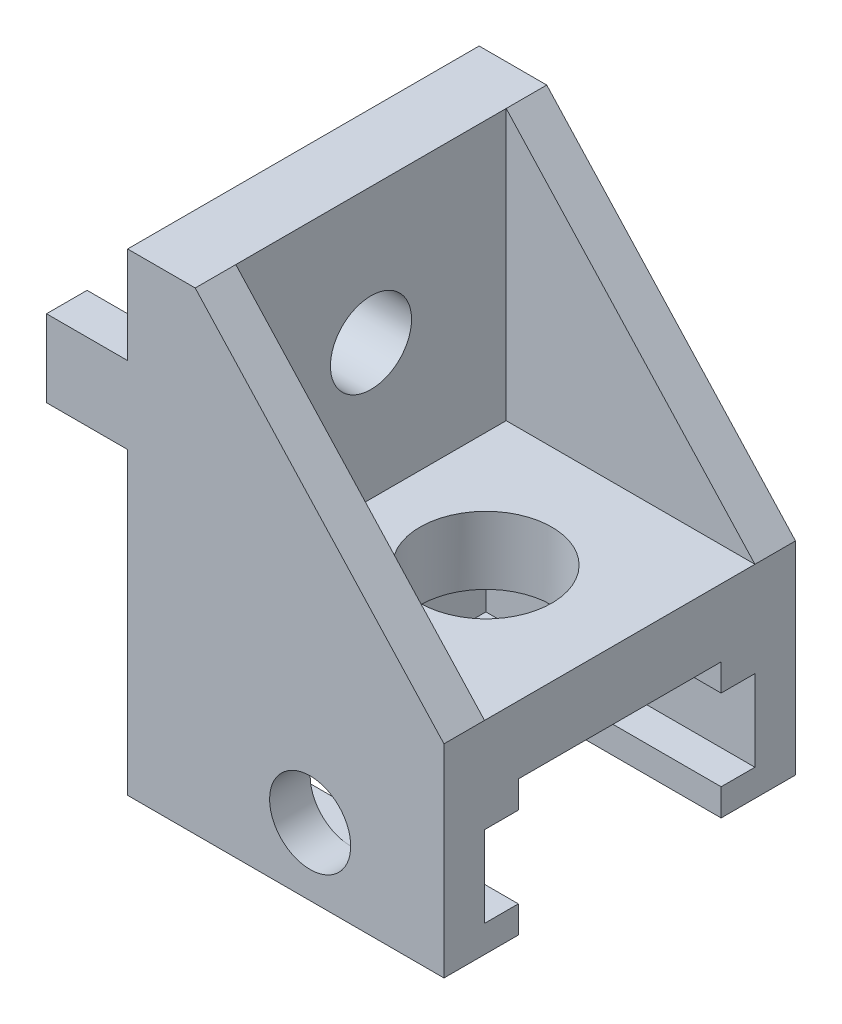
ISO-10303-21;
HEADER;
FILE_DESCRIPTION(('STEP AP214'),'2;1');
FILE_NAME('part.step','',(''),(''),'','','');
FILE_SCHEMA(('AUTOMOTIVE_DESIGN { 1 0 10303 214 1 1 1 1 }'));
ENDSEC;
DATA;
#1=APPLICATION_CONTEXT('core data for automotive mechanical design processes');
#2=APPLICATION_PROTOCOL_DEFINITION('international standard','automotive_design',2000,#1);
#3=PRODUCT_CONTEXT('',#1,'mechanical');
#4=PRODUCT('Part','Part','',(#3));
#5=PRODUCT_RELATED_PRODUCT_CATEGORY('part','',(#4));
#6=PRODUCT_DEFINITION_FORMATION('','',#4);
#7=PRODUCT_DEFINITION_CONTEXT('part definition',#1,'design');
#8=PRODUCT_DEFINITION('design','',#6,#7);
#9=PRODUCT_DEFINITION_SHAPE('','',#8);
#10=(LENGTH_UNIT() NAMED_UNIT(*) SI_UNIT(.MILLI.,.METRE.));
#11=(NAMED_UNIT(*) PLANE_ANGLE_UNIT() SI_UNIT($,.RADIAN.));
#12=(NAMED_UNIT(*) SI_UNIT($,.STERADIAN.) SOLID_ANGLE_UNIT());
#13=UNCERTAINTY_MEASURE_WITH_UNIT(LENGTH_MEASURE(1.E-05),#10,'distance_accuracy_value','');
#14=(GEOMETRIC_REPRESENTATION_CONTEXT(3) GLOBAL_UNCERTAINTY_ASSIGNED_CONTEXT((#13)) GLOBAL_UNIT_ASSIGNED_CONTEXT((#10,
#11,#12)) REPRESENTATION_CONTEXT('',''));
#15=CARTESIAN_POINT('',(0.,0.,0.));
#16=DIRECTION('',(0.,0.,1.));
#17=DIRECTION('',(1.,0.,0.));
#18=AXIS2_PLACEMENT_3D('',#15,#16,#17);
#19=CARTESIAN_POINT('',(0.,15.,0.));
#20=DIRECTION('',(0.,1.,0.));
#21=DIRECTION('',(0.,0.,1.));
#22=AXIS2_PLACEMENT_3D('',#19,#20,#21);
#23=PLANE('',#22);
#24=CARTESIAN_POINT('',(0.,15.,0.));
#25=DIRECTION('',(0.,1.,0.));
#26=DIRECTION('',(0.,0.,1.));
#27=AXIS2_PLACEMENT_3D('',#24,#25,#26);
#28=CIRCLE('',#27,4.875);
#29=CARTESIAN_POINT('',(0.,15.,4.875));
#30=VERTEX_POINT('',#29);
#31=EDGE_CURVE('E487',#30,#30,#28,.T.);
#32=ORIENTED_EDGE('',*,*,#31,.F.);
#33=EDGE_LOOP('',(#32));
#34=FACE_BOUND('',#33,.T.);
#35=DIRECTION('',(0.,0.,-1.));
#36=VECTOR('',#35,1.);
#37=CARTESIAN_POINT('',(-8.5,15.,13.));
#38=LINE('',#37,#36);
#39=CARTESIAN_POINT('',(-8.5,15.,10.));
#40=VERTEX_POINT('',#39);
#41=CARTESIAN_POINT('',(-8.5,15.,-10.));
#42=VERTEX_POINT('',#41);
#43=EDGE_CURVE('E330',#40,#42,#38,.T.);
#44=ORIENTED_EDGE('',*,*,#43,.F.);
#45=DIRECTION('',(1.,0.,0.));
#46=VECTOR('',#45,1.);
#47=CARTESIAN_POINT('',(9.89871535516886,15.,10.));
#48=LINE('',#47,#46);
#49=CARTESIAN_POINT('',(9.89871535516886,15.,10.));
#50=VERTEX_POINT('',#49);
#51=EDGE_CURVE('E279',#40,#50,#48,.T.);
#52=ORIENTED_EDGE('',*,*,#51,.T.);
#53=DIRECTION('',(0.,0.,-1.));
#54=VECTOR('',#53,1.);
#55=CARTESIAN_POINT('',(9.89871535516886,15.,13.));
#56=LINE('',#55,#54);
#57=CARTESIAN_POINT('',(9.89871535516886,15.,-10.));
#58=VERTEX_POINT('',#57);
#59=EDGE_CURVE('E370',#50,#58,#56,.T.);
#60=ORIENTED_EDGE('',*,*,#59,.T.);
#61=DIRECTION('',(-1.,0.,0.));
#62=VECTOR('',#61,1.);
#63=CARTESIAN_POINT('',(9.89871535516886,15.,-10.));
#64=LINE('',#63,#62);
#65=EDGE_CURVE('E322',#58,#42,#64,.T.);
#66=ORIENTED_EDGE('',*,*,#65,.T.);
#67=EDGE_LOOP('',(#44,#52,#60,#66));
#68=FACE_BOUND('',#67,.T.);
#69=ADVANCED_FACE('F35',(#34,#68),#23,.T.);
#70=CARTESIAN_POINT('',(-8.5,35.,13.));
#71=DIRECTION('',(-1.,0.,0.));
#72=DIRECTION('',(0.,0.,1.));
#73=AXIS2_PLACEMENT_3D('',#70,#71,#72);
#74=PLANE('',#73);
#75=CARTESIAN_POINT('',(-8.5,25.,0.));
#76=DIRECTION('',(1.,0.,0.));
#77=DIRECTION('',(0.,0.,-1.));
#78=AXIS2_PLACEMENT_3D('',#75,#76,#77);
#79=CIRCLE('',#78,3.);
#80=CARTESIAN_POINT('',(-8.5,25.,-3.));
#81=VERTEX_POINT('',#80);
#82=EDGE_CURVE('E261',#81,#81,#79,.T.);
#83=ORIENTED_EDGE('',*,*,#82,.F.);
#84=EDGE_LOOP('',(#83));
#85=FACE_BOUND('',#84,.T.);
#86=DIRECTION('',(0.,-1.,0.));
#87=VECTOR('',#86,1.);
#88=CARTESIAN_POINT('',(-8.5,15.,10.));
#89=LINE('',#88,#87);
#90=CARTESIAN_POINT('',(-8.5,35.,10.));
#91=VERTEX_POINT('',#90);
#92=EDGE_CURVE('E276',#91,#40,#89,.T.);
#93=ORIENTED_EDGE('',*,*,#92,.T.);
#94=ORIENTED_EDGE('',*,*,#43,.T.);
#95=DIRECTION('',(0.,1.,0.));
#96=VECTOR('',#95,1.);
#97=CARTESIAN_POINT('',(-8.5,15.,-10.));
#98=LINE('',#97,#96);
#99=CARTESIAN_POINT('',(-8.5,35.,-10.));
#100=VERTEX_POINT('',#99);
#101=EDGE_CURVE('E316',#42,#100,#98,.T.);
#102=ORIENTED_EDGE('',*,*,#101,.T.);
#103=DIRECTION('',(0.,0.,-1.));
#104=VECTOR('',#103,1.);
#105=CARTESIAN_POINT('',(-8.5,35.,13.));
#106=LINE('',#105,#104);
#107=EDGE_CURVE('E339',#91,#100,#106,.T.);
#108=ORIENTED_EDGE('',*,*,#107,.F.);
#109=EDGE_LOOP('',(#93,#94,#102,#108));
#110=FACE_BOUND('',#109,.T.);
#111=ADVANCED_FACE('F497',(#85,#110),#74,.F.);
#112=CARTESIAN_POINT('',(-13.5,15.,-13.));
#113=DIRECTION('',(1.,0.,0.));
#114=DIRECTION('',(0.,0.,-1.));
#115=AXIS2_PLACEMENT_3D('',#112,#113,#114);
#116=PLANE('',#115);
#117=CARTESIAN_POINT('',(-13.5,25.,0.));
#118=DIRECTION('',(1.,0.,0.));
#119=DIRECTION('',(0.,0.,-1.));
#120=AXIS2_PLACEMENT_3D('',#117,#118,#119);
#121=CIRCLE('',#120,3.);
#122=CARTESIAN_POINT('',(-13.5,25.,-3.));
#123=VERTEX_POINT('',#122);
#124=EDGE_CURVE('E268',#123,#123,#121,.T.);
#125=ORIENTED_EDGE('',*,*,#124,.T.);
#126=EDGE_LOOP('',(#125));
#127=FACE_BOUND('',#126,.T.);
#128=DIRECTION('',(0.,1.,0.));
#129=VECTOR('',#128,1.);
#130=CARTESIAN_POINT('',(-13.5,22.15,10.));
#131=LINE('',#130,#129);
#132=CARTESIAN_POINT('',(-13.5,22.15,10.));
#133=VERTEX_POINT('',#132);
#134=CARTESIAN_POINT('',(-13.5,27.85,10.));
#135=VERTEX_POINT('',#134);
#136=EDGE_CURVE('E252',#133,#135,#131,.T.);
#137=ORIENTED_EDGE('',*,*,#136,.T.);
#138=DIRECTION('',(0.,0.,1.));
#139=VECTOR('',#138,1.);
#140=CARTESIAN_POINT('',(-13.5,27.85,10.));
#141=LINE('',#140,#139);
#142=CARTESIAN_POINT('',(-13.5,27.85,13.));
#143=VERTEX_POINT('',#142);
#144=EDGE_CURVE('E272',#135,#143,#141,.T.);
#145=ORIENTED_EDGE('',*,*,#144,.T.);
#146=DIRECTION('',(0.,-1.,0.));
#147=VECTOR('',#146,1.);
#148=CARTESIAN_POINT('',(-13.5,15.,13.));
#149=LINE('',#148,#147);
#150=CARTESIAN_POINT('',(-13.5,35.,13.));
#151=VERTEX_POINT('',#150);
#152=EDGE_CURVE('E475',#151,#143,#149,.T.);
#153=ORIENTED_EDGE('',*,*,#152,.F.);
#154=DIRECTION('',(0.,0.,1.));
#155=VECTOR('',#154,1.);
#156=CARTESIAN_POINT('',(-13.5,35.,13.));
#157=LINE('',#156,#155);
#158=CARTESIAN_POINT('',(-13.5,35.,-13.));
#159=VERTEX_POINT('',#158);
#160=EDGE_CURVE('E333',#159,#151,#157,.T.);
#161=ORIENTED_EDGE('',*,*,#160,.F.);
#162=DIRECTION('',(0.,-1.,0.));
#163=VECTOR('',#162,1.);
#164=CARTESIAN_POINT('',(-13.5,15.,-13.));
#165=LINE('',#164,#163);
#166=CARTESIAN_POINT('',(-13.5,27.85,-13.));
#167=VERTEX_POINT('',#166);
#168=EDGE_CURVE('E44',#159,#167,#165,.T.);
#169=ORIENTED_EDGE('',*,*,#168,.T.);
#170=DIRECTION('',(0.,0.,-1.));
#171=VECTOR('',#170,1.);
#172=CARTESIAN_POINT('',(-13.5,27.85,-10.));
#173=LINE('',#172,#171);
#174=CARTESIAN_POINT('',(-13.5,27.85,-10.));
#175=VERTEX_POINT('',#174);
#176=EDGE_CURVE('E307',#175,#167,#173,.T.);
#177=ORIENTED_EDGE('',*,*,#176,.F.);
#178=DIRECTION('',(0.,-1.,0.));
#179=VECTOR('',#178,1.);
#180=CARTESIAN_POINT('',(-13.5,27.85,-10.));
#181=LINE('',#180,#179);
#182=CARTESIAN_POINT('',(-13.5,22.15,-10.));
#183=VERTEX_POINT('',#182);
#184=EDGE_CURVE('E286',#175,#183,#181,.T.);
#185=ORIENTED_EDGE('',*,*,#184,.T.);
#186=DIRECTION('',(0.,0.,-1.));
#187=VECTOR('',#186,1.);
#188=CARTESIAN_POINT('',(-13.5,22.15,-10.));
#189=LINE('',#188,#187);
#190=CARTESIAN_POINT('',(-13.5,22.15,-13.));
#191=VERTEX_POINT('',#190);
#192=EDGE_CURVE('E299',#183,#191,#189,.T.);
#193=ORIENTED_EDGE('',*,*,#192,.T.);
#194=CARTESIAN_POINT('',(-13.5,0.,-13.));
#195=VERTEX_POINT('',#194);
#196=EDGE_CURVE('E478',#191,#195,#165,.T.);
#197=ORIENTED_EDGE('',*,*,#196,.T.);
#198=DIRECTION('',(0.,0.,1.));
#199=VECTOR('',#198,1.);
#200=CARTESIAN_POINT('',(-13.5,0.,-13.));
#201=LINE('',#200,#199);
#202=CARTESIAN_POINT('',(-13.5,0.,13.));
#203=VERTEX_POINT('',#202);
#204=EDGE_CURVE('E468',#195,#203,#201,.T.);
#205=ORIENTED_EDGE('',*,*,#204,.T.);
#206=CARTESIAN_POINT('',(-13.5,22.15,13.));
#207=VERTEX_POINT('',#206);
#208=EDGE_CURVE('E474',#207,#203,#149,.T.);
#209=ORIENTED_EDGE('',*,*,#208,.F.);
#210=DIRECTION('',(0.,0.,1.));
#211=VECTOR('',#210,1.);
#212=CARTESIAN_POINT('',(-13.5,22.15,10.));
#213=LINE('',#212,#211);
#214=EDGE_CURVE('E242',#133,#207,#213,.T.);
#215=ORIENTED_EDGE('',*,*,#214,.F.);
#216=EDGE_LOOP('',(#137,#145,#153,#161,#169,#177,#185,#193,#197,#205,#209,#215));
#217=FACE_BOUND('',#216,.T.);
#218=ADVANCED_FACE('F521',(#127,#217),#116,.F.);
#219=CARTESIAN_POINT('',(-10.,0.,9.99999999999999));
#220=DIRECTION('',(0.,0.,1.));
#221=DIRECTION('',(1.,0.,0.));
#222=AXIS2_PLACEMENT_3D('',#219,#220,#221);
#223=PLANE('',#222);
#224=DIRECTION('',(1.,0.,0.));
#225=VECTOR('',#224,1.);
#226=CARTESIAN_POINT('',(-10.,8.00000000000002,9.99999999999999));
#227=LINE('',#226,#225);
#228=CARTESIAN_POINT('',(-10.,8.00000000000002,9.99999999999999));
#229=VERTEX_POINT('',#228);
#230=CARTESIAN_POINT('',(0.,8.00000000000002,9.99999999999999));
#231=VERTEX_POINT('',#230);
#232=EDGE_CURVE('E443',#229,#231,#227,.T.);
#233=ORIENTED_EDGE('',*,*,#232,.T.);
#234=CARTESIAN_POINT('',(0.,5.00000000000001,9.99999999999999));
#235=DIRECTION('',(0.,0.,1.));
#236=DIRECTION('',(1.,0.,0.));
#237=AXIS2_PLACEMENT_3D('',#234,#235,#236);
#238=CIRCLE('',#237,3.);
#239=CARTESIAN_POINT('',(0.,2.00000000000002,9.99999999999999));
#240=VERTEX_POINT('',#239);
#241=EDGE_CURVE('E359',#231,#240,#238,.T.);
#242=ORIENTED_EDGE('',*,*,#241,.T.);
#243=DIRECTION('',(1.,0.,0.));
#244=VECTOR('',#243,1.);
#245=CARTESIAN_POINT('',(-10.,2.00000000000002,9.99999999999999));
#246=LINE('',#245,#244);
#247=CARTESIAN_POINT('',(-10.,2.00000000000002,9.99999999999999));
#248=VERTEX_POINT('',#247);
#249=EDGE_CURVE('E439',#248,#240,#246,.T.);
#250=ORIENTED_EDGE('',*,*,#249,.F.);
#251=DIRECTION('',(0.,-1.,0.));
#252=VECTOR('',#251,1.);
#253=CARTESIAN_POINT('',(-10.,0.,9.99999999999999));
#254=LINE('',#253,#252);
#255=EDGE_CURVE('E418',#229,#248,#254,.T.);
#256=ORIENTED_EDGE('',*,*,#255,.F.);
#257=EDGE_LOOP('',(#233,#242,#250,#256));
#258=FACE_BOUND('',#257,.T.);
#259=ADVANCED_FACE('F601',(#258),#223,.F.);
#260=CARTESIAN_POINT('',(-10.,0.,-10.));
#261=DIRECTION('',(0.,0.,1.));
#262=DIRECTION('',(0.,-1.,0.));
#263=AXIS2_PLACEMENT_3D('',#260,#261,#262);
#264=PLANE('',#263);
#265=CARTESIAN_POINT('',(0.,5.00000000000001,-10.));
#266=DIRECTION('',(0.,0.,1.));
#267=DIRECTION('',(0.,-1.,0.));
#268=AXIS2_PLACEMENT_3D('',#265,#266,#267);
#269=CIRCLE('',#268,3.);
#270=CARTESIAN_POINT('',(0.,2.00000000000001,-10.));
#271=VERTEX_POINT('',#270);
#272=CARTESIAN_POINT('',(0.,8.00000000000002,-10.));
#273=VERTEX_POINT('',#272);
#274=EDGE_CURVE('E355',#271,#273,#269,.T.);
#275=ORIENTED_EDGE('',*,*,#274,.F.);
#276=DIRECTION('',(1.,0.,0.));
#277=VECTOR('',#276,1.);
#278=CARTESIAN_POINT('',(-10.,2.00000000000002,-10.));
#279=LINE('',#278,#277);
#280=CARTESIAN_POINT('',(9.89871535516885,2.00000000000002,-10.));
#281=VERTEX_POINT('',#280);
#282=EDGE_CURVE('E464',#271,#281,#279,.T.);
#283=ORIENTED_EDGE('',*,*,#282,.T.);
#284=DIRECTION('',(0.,-1.,0.));
#285=VECTOR('',#284,1.);
#286=CARTESIAN_POINT('',(9.89871535516885,0.,-10.));
#287=LINE('',#286,#285);
#288=CARTESIAN_POINT('',(9.89871535516886,8.00000000000002,-10.));
#289=VERTEX_POINT('',#288);
#290=EDGE_CURVE('E369',#289,#281,#287,.T.);
#291=ORIENTED_EDGE('',*,*,#290,.F.);
#292=DIRECTION('',(1.,0.,0.));
#293=VECTOR('',#292,1.);
#294=CARTESIAN_POINT('',(-10.,8.00000000000002,-10.));
#295=LINE('',#294,#293);
#296=EDGE_CURVE('E460',#273,#289,#295,.T.);
#297=ORIENTED_EDGE('',*,*,#296,.F.);
#298=EDGE_LOOP('',(#275,#283,#291,#297));
#299=FACE_BOUND('',#298,.T.);
#300=ADVANCED_FACE('F625',(#299),#264,.T.);
#301=CARTESIAN_POINT('',(0.,0.,0.));
#302=DIRECTION('',(0.,1.,0.));
#303=DIRECTION('',(0.,0.,1.));
#304=AXIS2_PLACEMENT_3D('',#301,#302,#303);
#305=PLANE('',#304);
#306=DIRECTION('',(-1.,0.,0.));
#307=VECTOR('',#306,1.);
#308=CARTESIAN_POINT('',(-13.5,0.,-13.));
#309=LINE('',#308,#307);
#310=CARTESIAN_POINT('',(9.89871535516886,0.,-13.));
#311=VERTEX_POINT('',#310);
#312=EDGE_CURVE('E433',#311,#195,#309,.T.);
#313=ORIENTED_EDGE('',*,*,#312,.F.);
#314=DIRECTION('',(0.,0.,-1.));
#315=VECTOR('',#314,1.);
#316=CARTESIAN_POINT('',(9.89871535516886,0.,13.));
#317=LINE('',#316,#315);
#318=CARTESIAN_POINT('',(9.89871535516886,0.,-7.50000000000002));
#319=VERTEX_POINT('',#318);
#320=EDGE_CURVE('E363',#319,#311,#317,.T.);
#321=ORIENTED_EDGE('',*,*,#320,.F.);
#322=DIRECTION('',(1.,0.,0.));
#323=VECTOR('',#322,1.);
#324=CARTESIAN_POINT('',(-10.,0.,-7.50000000000001));
#325=LINE('',#324,#323);
#326=CARTESIAN_POINT('',(-10.,0.,-7.50000000000001));
#327=VERTEX_POINT('',#326);
#328=EDGE_CURVE('E430',#327,#319,#325,.T.);
#329=ORIENTED_EDGE('',*,*,#328,.F.);
#330=DIRECTION('',(0.,0.,-1.));
#331=VECTOR('',#330,1.);
#332=CARTESIAN_POINT('',(-10.,0.,0.));
#333=LINE('',#332,#331);
#334=CARTESIAN_POINT('',(-10.,0.,7.49999999999999));
#335=VERTEX_POINT('',#334);
#336=EDGE_CURVE('E426',#335,#327,#333,.T.);
#337=ORIENTED_EDGE('',*,*,#336,.F.);
#338=DIRECTION('',(1.,0.,0.));
#339=VECTOR('',#338,1.);
#340=CARTESIAN_POINT('',(-10.,0.,7.49999999999999));
#341=LINE('',#340,#339);
#342=CARTESIAN_POINT('',(9.89871535516886,0.,7.49999999999998));
#343=VERTEX_POINT('',#342);
#344=EDGE_CURVE('E434',#335,#343,#341,.T.);
#345=ORIENTED_EDGE('',*,*,#344,.T.);
#346=CARTESIAN_POINT('',(9.89871535516886,0.,13.));
#347=VERTEX_POINT('',#346);
#348=EDGE_CURVE('E371',#347,#343,#317,.T.);
#349=ORIENTED_EDGE('',*,*,#348,.F.);
#350=DIRECTION('',(1.,0.,0.));
#351=VECTOR('',#350,1.);
#352=CARTESIAN_POINT('',(-13.5,0.,13.));
#353=LINE('',#352,#351);
#354=EDGE_CURVE('E471',#203,#347,#353,.T.);
#355=ORIENTED_EDGE('',*,*,#354,.F.);
#356=ORIENTED_EDGE('',*,*,#204,.F.);
#357=EDGE_LOOP('',(#313,#321,#329,#337,#345,#349,#355,#356));
#358=FACE_BOUND('',#357,.T.);
#359=ADVANCED_FACE('F535',(#358),#305,.F.);
#360=CARTESIAN_POINT('',(-13.5,15.,-13.));
#361=DIRECTION('',(0.,0.,1.));
#362=DIRECTION('',(1.,0.,0.));
#363=AXIS2_PLACEMENT_3D('',#360,#361,#362);
#364=PLANE('',#363);
#365=CARTESIAN_POINT('',(0.,5.00000000000001,-13.));
#366=DIRECTION('',(0.,0.,-1.));
#367=DIRECTION('',(-1.,0.,0.));
#368=AXIS2_PLACEMENT_3D('',#365,#366,#367);
#369=CIRCLE('',#368,3.);
#370=CARTESIAN_POINT('',(-3.,5.00000000000001,-13.));
#371=VERTEX_POINT('',#370);
#372=EDGE_CURVE('E346',#371,#371,#369,.T.);
#373=ORIENTED_EDGE('',*,*,#372,.F.);
#374=EDGE_LOOP('',(#373));
#375=FACE_BOUND('',#374,.T.);
#376=DIRECTION('',(0.677030928151955,-0.735954565394972,0.));
#377=VECTOR('',#376,1.);
#378=CARTESIAN_POINT('',(-8.5,35.,-13.));
#379=LINE('',#378,#377);
#380=CARTESIAN_POINT('',(-8.5,35.,-13.));
#381=VERTEX_POINT('',#380);
#382=CARTESIAN_POINT('',(9.89871535516886,15.,-13.));
#383=VERTEX_POINT('',#382);
#384=EDGE_CURVE('E309',#381,#383,#379,.T.);
#385=ORIENTED_EDGE('',*,*,#384,.T.);
#386=DIRECTION('',(0.,1.,0.));
#387=VECTOR('',#386,1.);
#388=CARTESIAN_POINT('',(9.89871535516886,15.,-13.));
#389=LINE('',#388,#387);
#390=EDGE_CURVE('E364',#311,#383,#389,.T.);
#391=ORIENTED_EDGE('',*,*,#390,.F.);
#392=ORIENTED_EDGE('',*,*,#312,.T.);
#393=ORIENTED_EDGE('',*,*,#196,.F.);
#394=DIRECTION('',(-1.,0.,0.));
#395=VECTOR('',#394,1.);
#396=CARTESIAN_POINT('',(-13.5,22.15,-13.));
#397=LINE('',#396,#395);
#398=CARTESIAN_POINT('',(-19.5,22.15,-13.));
#399=VERTEX_POINT('',#398);
#400=EDGE_CURVE('E283',#191,#399,#397,.T.);
#401=ORIENTED_EDGE('',*,*,#400,.T.);
#402=DIRECTION('',(0.,1.,0.));
#403=VECTOR('',#402,1.);
#404=CARTESIAN_POINT('',(-19.5,27.85,-13.));
#405=LINE('',#404,#403);
#406=CARTESIAN_POINT('',(-19.5,27.85,-13.));
#407=VERTEX_POINT('',#406);
#408=EDGE_CURVE('E302',#399,#407,#405,.T.);
#409=ORIENTED_EDGE('',*,*,#408,.T.);
#410=DIRECTION('',(1.,0.,0.));
#411=VECTOR('',#410,1.);
#412=CARTESIAN_POINT('',(-13.5,27.85,-13.));
#413=LINE('',#412,#411);
#414=EDGE_CURVE('E290',#407,#167,#413,.T.);
#415=ORIENTED_EDGE('',*,*,#414,.T.);
#416=ORIENTED_EDGE('',*,*,#168,.F.);
#417=DIRECTION('',(-1.,0.,0.));
#418=VECTOR('',#417,1.);
#419=CARTESIAN_POINT('',(-13.5,35.,-13.));
#420=LINE('',#419,#418);
#421=EDGE_CURVE('E343',#381,#159,#420,.T.);
#422=ORIENTED_EDGE('',*,*,#421,.F.);
#423=EDGE_LOOP('',(#385,#391,#392,#393,#401,#409,#415,#416,#422));
#424=FACE_BOUND('',#423,.T.);
#425=ADVANCED_FACE('F37',(#375,#424),#364,.F.);
#426=CARTESIAN_POINT('',(-13.5,15.,13.));
#427=DIRECTION('',(0.,0.,-1.));
#428=DIRECTION('',(-1.,0.,0.));
#429=AXIS2_PLACEMENT_3D('',#426,#427,#428);
#430=PLANE('',#429);
#431=DIRECTION('',(0.,1.,0.));
#432=VECTOR('',#431,1.);
#433=CARTESIAN_POINT('',(9.89871535516886,15.,13.));
#434=LINE('',#433,#432);
#435=CARTESIAN_POINT('',(9.89871535516886,15.,13.));
#436=VERTEX_POINT('',#435);
#437=EDGE_CURVE('E360',#347,#436,#434,.T.);
#438=ORIENTED_EDGE('',*,*,#437,.T.);
#439=DIRECTION('',(-0.677030928151955,0.735954565394972,0.));
#440=VECTOR('',#439,1.);
#441=CARTESIAN_POINT('',(-8.5,35.,13.));
#442=LINE('',#441,#440);
#443=CARTESIAN_POINT('',(-8.5,35.,13.));
#444=VERTEX_POINT('',#443);
#445=EDGE_CURVE('E271',#436,#444,#442,.T.);
#446=ORIENTED_EDGE('',*,*,#445,.T.);
#447=DIRECTION('',(1.,0.,0.));
#448=VECTOR('',#447,1.);
#449=CARTESIAN_POINT('',(-13.5,35.,13.));
#450=LINE('',#449,#448);
#451=EDGE_CURVE('E336',#151,#444,#450,.T.);
#452=ORIENTED_EDGE('',*,*,#451,.F.);
#453=ORIENTED_EDGE('',*,*,#152,.T.);
#454=DIRECTION('',(-1.,0.,0.));
#455=VECTOR('',#454,1.);
#456=CARTESIAN_POINT('',(-13.5,27.85,13.));
#457=LINE('',#456,#455);
#458=CARTESIAN_POINT('',(-19.5,27.85,13.));
#459=VERTEX_POINT('',#458);
#460=EDGE_CURVE('E256',#143,#459,#457,.T.);
#461=ORIENTED_EDGE('',*,*,#460,.T.);
#462=DIRECTION('',(0.,-1.,0.));
#463=VECTOR('',#462,1.);
#464=CARTESIAN_POINT('',(-19.5,27.85,13.));
#465=LINE('',#464,#463);
#466=CARTESIAN_POINT('',(-19.5,22.15,13.));
#467=VERTEX_POINT('',#466);
#468=EDGE_CURVE('E266',#459,#467,#465,.T.);
#469=ORIENTED_EDGE('',*,*,#468,.T.);
#470=DIRECTION('',(1.,0.,0.));
#471=VECTOR('',#470,1.);
#472=CARTESIAN_POINT('',(-19.5,22.15,13.));
#473=LINE('',#472,#471);
#474=EDGE_CURVE('E52',#467,#207,#473,.T.);
#475=ORIENTED_EDGE('',*,*,#474,.T.);
#476=ORIENTED_EDGE('',*,*,#208,.T.);
#477=ORIENTED_EDGE('',*,*,#354,.T.);
#478=EDGE_LOOP('',(#438,#446,#452,#453,#461,#469,#475,#476,#477));
#479=FACE_BOUND('',#478,.T.);
#480=CARTESIAN_POINT('',(0.,5.00000000000001,13.));
#481=DIRECTION('',(0.,0.,-1.));
#482=DIRECTION('',(-1.,0.,0.));
#483=AXIS2_PLACEMENT_3D('',#480,#481,#482);
#484=CIRCLE('',#483,3.);
#485=CARTESIAN_POINT('',(-3.,5.00000000000001,13.));
#486=VERTEX_POINT('',#485);
#487=EDGE_CURVE('E348',#486,#486,#484,.T.);
#488=ORIENTED_EDGE('',*,*,#487,.T.);
#489=EDGE_LOOP('',(#488));
#490=FACE_BOUND('',#489,.T.);
#491=ADVANCED_FACE('F523',(#479,#490),#430,.F.);
#492=CARTESIAN_POINT('',(-10.,0.,-7.50000000000001));
#493=DIRECTION('',(0.,0.,1.));
#494=DIRECTION('',(1.,0.,0.));
#495=AXIS2_PLACEMENT_3D('',#492,#493,#494);
#496=PLANE('',#495);
#497=DIRECTION('',(0.,-1.,0.));
#498=VECTOR('',#497,1.);
#499=CARTESIAN_POINT('',(9.89871535516885,0.,-7.50000000000001));
#500=LINE('',#499,#498);
#501=CARTESIAN_POINT('',(9.89871535516886,2.00000000000002,-7.50000000000001));
#502=VERTEX_POINT('',#501);
#503=EDGE_CURVE('E398',#502,#319,#500,.T.);
#504=ORIENTED_EDGE('',*,*,#503,.F.);
#505=DIRECTION('',(1.,0.,0.));
#506=VECTOR('',#505,1.);
#507=CARTESIAN_POINT('',(-10.,2.00000000000002,-7.50000000000001));
#508=LINE('',#507,#506);
#509=CARTESIAN_POINT('',(-10.,2.00000000000002,-7.50000000000001));
#510=VERTEX_POINT('',#509);
#511=EDGE_CURVE('E429',#510,#502,#508,.T.);
#512=ORIENTED_EDGE('',*,*,#511,.F.);
#513=DIRECTION('',(0.,-1.,0.));
#514=VECTOR('',#513,1.);
#515=CARTESIAN_POINT('',(-10.,0.,-7.50000000000001));
#516=LINE('',#515,#514);
#517=EDGE_CURVE('E400',#510,#327,#516,.T.);
#518=ORIENTED_EDGE('',*,*,#517,.T.);
#519=ORIENTED_EDGE('',*,*,#328,.T.);
#520=EDGE_LOOP('',(#504,#512,#518,#519));
#521=FACE_BOUND('',#520,.T.);
#522=ADVANCED_FACE('F591',(#521),#496,.T.);
#523=CARTESIAN_POINT('',(-10.,0.,7.49999999999999));
#524=DIRECTION('',(0.,0.,1.));
#525=DIRECTION('',(1.,0.,0.));
#526=AXIS2_PLACEMENT_3D('',#523,#524,#525);
#527=PLANE('',#526);
#528=DIRECTION('',(1.,0.,0.));
#529=VECTOR('',#528,1.);
#530=CARTESIAN_POINT('',(-10.,2.00000000000002,7.49999999999999));
#531=LINE('',#530,#529);
#532=CARTESIAN_POINT('',(-10.,2.00000000000002,7.49999999999999));
#533=VERTEX_POINT('',#532);
#534=CARTESIAN_POINT('',(9.89871535516886,2.00000000000002,7.49999999999998));
#535=VERTEX_POINT('',#534);
#536=EDGE_CURVE('E437',#533,#535,#531,.T.);
#537=ORIENTED_EDGE('',*,*,#536,.T.);
#538=DIRECTION('',(0.,-1.,0.));
#539=VECTOR('',#538,1.);
#540=CARTESIAN_POINT('',(9.89871535516885,0.,7.49999999999998));
#541=LINE('',#540,#539);
#542=EDGE_CURVE('E395',#535,#343,#541,.T.);
#543=ORIENTED_EDGE('',*,*,#542,.T.);
#544=ORIENTED_EDGE('',*,*,#344,.F.);
#545=DIRECTION('',(0.,-1.,0.));
#546=VECTOR('',#545,1.);
#547=CARTESIAN_POINT('',(-10.,0.,7.49999999999999));
#548=LINE('',#547,#546);
#549=EDGE_CURVE('E424',#533,#335,#548,.T.);
#550=ORIENTED_EDGE('',*,*,#549,.F.);
#551=EDGE_LOOP('',(#537,#543,#544,#550));
#552=FACE_BOUND('',#551,.T.);
#553=ADVANCED_FACE('F587',(#552),#527,.F.);
#554=CARTESIAN_POINT('',(-10.,2.00000000000002,0.));
#555=DIRECTION('',(0.,-1.,0.));
#556=DIRECTION('',(0.,0.,-1.));
#557=AXIS2_PLACEMENT_3D('',#554,#555,#556);
#558=PLANE('',#557);
#559=ORIENTED_EDGE('',*,*,#249,.T.);
#560=CARTESIAN_POINT('',(9.89871535516885,2.00000000000002,9.99999999999999));
#561=VERTEX_POINT('',#560);
#562=EDGE_CURVE('E442',#240,#561,#246,.T.);
#563=ORIENTED_EDGE('',*,*,#562,.T.);
#564=DIRECTION('',(0.,0.,-1.));
#565=VECTOR('',#564,1.);
#566=CARTESIAN_POINT('',(9.89871535516886,2.00000000000002,0.));
#567=LINE('',#566,#565);
#568=EDGE_CURVE('E392',#561,#535,#567,.T.);
#569=ORIENTED_EDGE('',*,*,#568,.T.);
#570=ORIENTED_EDGE('',*,*,#536,.F.);
#571=DIRECTION('',(0.,0.,-1.));
#572=VECTOR('',#571,1.);
#573=CARTESIAN_POINT('',(-10.,2.00000000000002,0.));
#574=LINE('',#573,#572);
#575=EDGE_CURVE('E421',#248,#533,#574,.T.);
#576=ORIENTED_EDGE('',*,*,#575,.F.);
#577=EDGE_LOOP('',(#559,#563,#569,#570,#576));
#578=FACE_BOUND('',#577,.T.);
#579=ADVANCED_FACE('F590',(#578),#558,.F.);
#580=ORIENTED_EDGE('',*,*,#562,.F.);
#581=EDGE_CURVE('E356',#240,#231,#238,.T.);
#582=ORIENTED_EDGE('',*,*,#581,.T.);
#583=CARTESIAN_POINT('',(9.89871535516886,8.00000000000002,9.99999999999999));
#584=VERTEX_POINT('',#583);
#585=EDGE_CURVE('E446',#231,#584,#227,.T.);
#586=ORIENTED_EDGE('',*,*,#585,.T.);
#587=DIRECTION('',(0.,-1.,0.));
#588=VECTOR('',#587,1.);
#589=CARTESIAN_POINT('',(9.89871535516885,0.,9.99999999999999));
#590=LINE('',#589,#588);
#591=EDGE_CURVE('E389',#584,#561,#590,.T.);
#592=ORIENTED_EDGE('',*,*,#591,.T.);
#593=EDGE_LOOP('',(#580,#582,#586,#592));
#594=FACE_BOUND('',#593,.T.);
#595=ADVANCED_FACE('F595',(#594),#223,.F.);
#596=CARTESIAN_POINT('',(-10.,8.00000000000002,0.));
#597=DIRECTION('',(0.,-1.,0.));
#598=DIRECTION('',(0.,0.,-1.));
#599=AXIS2_PLACEMENT_3D('',#596,#597,#598);
#600=PLANE('',#599);
#601=DIRECTION('',(1.,0.,0.));
#602=VECTOR('',#601,1.);
#603=CARTESIAN_POINT('',(-10.,8.00000000000002,7.49999999999999));
#604=LINE('',#603,#602);
#605=CARTESIAN_POINT('',(-10.,8.00000000000002,7.49999999999999));
#606=VERTEX_POINT('',#605);
#607=CARTESIAN_POINT('',(9.89871535516886,8.00000000000002,7.49999999999998));
#608=VERTEX_POINT('',#607);
#609=EDGE_CURVE('E447',#606,#608,#604,.T.);
#610=ORIENTED_EDGE('',*,*,#609,.T.);
#611=DIRECTION('',(0.,0.,-1.));
#612=VECTOR('',#611,1.);
#613=CARTESIAN_POINT('',(9.89871535516886,8.00000000000002,0.));
#614=LINE('',#613,#612);
#615=EDGE_CURVE('E386',#584,#608,#614,.T.);
#616=ORIENTED_EDGE('',*,*,#615,.F.);
#617=ORIENTED_EDGE('',*,*,#585,.F.);
#618=ORIENTED_EDGE('',*,*,#232,.F.);
#619=DIRECTION('',(0.,0.,-1.));
#620=VECTOR('',#619,1.);
#621=CARTESIAN_POINT('',(-10.,8.00000000000002,0.));
#622=LINE('',#621,#620);
#623=EDGE_CURVE('E416',#229,#606,#622,.T.);
#624=ORIENTED_EDGE('',*,*,#623,.T.);
#625=EDGE_LOOP('',(#610,#616,#617,#618,#624));
#626=FACE_BOUND('',#625,.T.);
#627=ADVANCED_FACE('F599',(#626),#600,.T.);
#628=CARTESIAN_POINT('',(-10.,0.,7.49999999999999));
#629=DIRECTION('',(0.,0.,1.));
#630=DIRECTION('',(1.,0.,0.));
#631=AXIS2_PLACEMENT_3D('',#628,#629,#630);
#632=PLANE('',#631);
#633=DIRECTION('',(1.,0.,0.));
#634=VECTOR('',#633,1.);
#635=CARTESIAN_POINT('',(-10.,10.,7.49999999999999));
#636=LINE('',#635,#634);
#637=CARTESIAN_POINT('',(-10.,10.,7.49999999999999));
#638=VERTEX_POINT('',#637);
#639=CARTESIAN_POINT('',(9.89871535516886,10.,7.49999999999999));
#640=VERTEX_POINT('',#639);
#641=EDGE_CURVE('E449',#638,#640,#636,.T.);
#642=ORIENTED_EDGE('',*,*,#641,.T.);
#643=DIRECTION('',(0.,-1.,0.));
#644=VECTOR('',#643,1.);
#645=CARTESIAN_POINT('',(9.89871535516885,0.,7.49999999999998));
#646=LINE('',#645,#644);
#647=EDGE_CURVE('E383',#640,#608,#646,.T.);
#648=ORIENTED_EDGE('',*,*,#647,.T.);
#649=ORIENTED_EDGE('',*,*,#609,.F.);
#650=DIRECTION('',(0.,-1.,0.));
#651=VECTOR('',#650,1.);
#652=CARTESIAN_POINT('',(-10.,0.,7.49999999999999));
#653=LINE('',#652,#651);
#654=EDGE_CURVE('E413',#638,#606,#653,.T.);
#655=ORIENTED_EDGE('',*,*,#654,.F.);
#656=EDGE_LOOP('',(#642,#648,#649,#655));
#657=FACE_BOUND('',#656,.T.);
#658=ADVANCED_FACE('F604',(#657),#632,.F.);
#659=CARTESIAN_POINT('',(-10.,10.,0.));
#660=DIRECTION('',(0.,-1.,0.));
#661=DIRECTION('',(0.,0.,-1.));
#662=AXIS2_PLACEMENT_3D('',#659,#660,#661);
#663=PLANE('',#662);
#664=CARTESIAN_POINT('',(0.,10.,0.));
#665=DIRECTION('',(0.,-1.,0.));
#666=DIRECTION('',(0.,0.,-1.));
#667=AXIS2_PLACEMENT_3D('',#664,#665,#666);
#668=CIRCLE('',#667,4.875);
#669=CARTESIAN_POINT('',(0.,10.,-4.875));
#670=VERTEX_POINT('',#669);
#671=EDGE_CURVE('E39',#670,#670,#668,.T.);
#672=ORIENTED_EDGE('',*,*,#671,.F.);
#673=EDGE_LOOP('',(#672));
#674=FACE_BOUND('',#673,.T.);
#675=DIRECTION('',(0.,0.,-1.));
#676=VECTOR('',#675,1.);
#677=CARTESIAN_POINT('',(9.89871535516886,10.,0.));
#678=LINE('',#677,#676);
#679=CARTESIAN_POINT('',(9.89871535516886,10.,-7.50000000000001));
#680=VERTEX_POINT('',#679);
#681=EDGE_CURVE('E381',#640,#680,#678,.T.);
#682=ORIENTED_EDGE('',*,*,#681,.F.);
#683=ORIENTED_EDGE('',*,*,#641,.F.);
#684=DIRECTION('',(0.,0.,-1.));
#685=VECTOR('',#684,1.);
#686=CARTESIAN_POINT('',(-10.,10.,0.));
#687=LINE('',#686,#685);
#688=CARTESIAN_POINT('',(-10.,10.,-7.50000000000001));
#689=VERTEX_POINT('',#688);
#690=EDGE_CURVE('E411',#638,#689,#687,.T.);
#691=ORIENTED_EDGE('',*,*,#690,.T.);
#692=DIRECTION('',(1.,0.,0.));
#693=VECTOR('',#692,1.);
#694=CARTESIAN_POINT('',(-10.,10.,-7.50000000000001));
#695=LINE('',#694,#693);
#696=EDGE_CURVE('E452',#689,#680,#695,.T.);
#697=ORIENTED_EDGE('',*,*,#696,.T.);
#698=EDGE_LOOP('',(#682,#683,#691,#697));
#699=FACE_BOUND('',#698,.T.);
#700=ADVANCED_FACE('F608',(#674,#699),#663,.T.);
#701=CARTESIAN_POINT('',(-10.,0.,-7.50000000000001));
#702=DIRECTION('',(0.,0.,1.));
#703=DIRECTION('',(1.,0.,0.));
#704=AXIS2_PLACEMENT_3D('',#701,#702,#703);
#705=PLANE('',#704);
#706=DIRECTION('',(0.,-1.,0.));
#707=VECTOR('',#706,1.);
#708=CARTESIAN_POINT('',(9.89871535516885,0.,-7.50000000000001));
#709=LINE('',#708,#707);
#710=CARTESIAN_POINT('',(9.89871535516886,8.00000000000002,-7.50000000000001));
#711=VERTEX_POINT('',#710);
#712=EDGE_CURVE('E378',#680,#711,#709,.T.);
#713=ORIENTED_EDGE('',*,*,#712,.F.);
#714=ORIENTED_EDGE('',*,*,#696,.F.);
#715=DIRECTION('',(0.,-1.,0.));
#716=VECTOR('',#715,1.);
#717=CARTESIAN_POINT('',(-10.,0.,-7.50000000000001));
#718=LINE('',#717,#716);
#719=CARTESIAN_POINT('',(-10.,8.00000000000002,-7.50000000000001));
#720=VERTEX_POINT('',#719);
#721=EDGE_CURVE('E409',#689,#720,#718,.T.);
#722=ORIENTED_EDGE('',*,*,#721,.T.);
#723=DIRECTION('',(1.,0.,0.));
#724=VECTOR('',#723,1.);
#725=CARTESIAN_POINT('',(-10.,8.00000000000002,-7.50000000000001));
#726=LINE('',#725,#724);
#727=EDGE_CURVE('E455',#720,#711,#726,.T.);
#728=ORIENTED_EDGE('',*,*,#727,.T.);
#729=EDGE_LOOP('',(#713,#714,#722,#728));
#730=FACE_BOUND('',#729,.T.);
#731=ADVANCED_FACE('F612',(#730),#705,.T.);
#732=CARTESIAN_POINT('',(-10.,8.00000000000002,0.));
#733=DIRECTION('',(0.,-1.,0.));
#734=DIRECTION('',(0.,0.,-1.));
#735=AXIS2_PLACEMENT_3D('',#732,#733,#734);
#736=PLANE('',#735);
#737=CARTESIAN_POINT('',(-10.,8.00000000000002,-10.));
#738=VERTEX_POINT('',#737);
#739=EDGE_CURVE('E457',#738,#273,#295,.T.);
#740=ORIENTED_EDGE('',*,*,#739,.T.);
#741=ORIENTED_EDGE('',*,*,#296,.T.);
#742=DIRECTION('',(0.,0.,-1.));
#743=VECTOR('',#742,1.);
#744=CARTESIAN_POINT('',(9.89871535516886,8.00000000000002,0.));
#745=LINE('',#744,#743);
#746=EDGE_CURVE('E375',#711,#289,#745,.T.);
#747=ORIENTED_EDGE('',*,*,#746,.F.);
#748=ORIENTED_EDGE('',*,*,#727,.F.);
#749=DIRECTION('',(0.,0.,-1.));
#750=VECTOR('',#749,1.);
#751=CARTESIAN_POINT('',(-10.,8.00000000000002,0.));
#752=LINE('',#751,#750);
#753=EDGE_CURVE('E407',#720,#738,#752,.T.);
#754=ORIENTED_EDGE('',*,*,#753,.T.);
#755=EDGE_LOOP('',(#740,#741,#747,#748,#754));
#756=FACE_BOUND('',#755,.T.);
#757=ADVANCED_FACE('F616',(#756),#736,.T.);
#758=EDGE_CURVE('E351',#273,#271,#269,.T.);
#759=ORIENTED_EDGE('',*,*,#758,.F.);
#760=ORIENTED_EDGE('',*,*,#739,.F.);
#761=DIRECTION('',(0.,-1.,0.));
#762=VECTOR('',#761,1.);
#763=CARTESIAN_POINT('',(-10.,0.,-10.));
#764=LINE('',#763,#762);
#765=CARTESIAN_POINT('',(-10.,2.00000000000002,-10.));
#766=VERTEX_POINT('',#765);
#767=EDGE_CURVE('E405',#738,#766,#764,.T.);
#768=ORIENTED_EDGE('',*,*,#767,.T.);
#769=EDGE_CURVE('E461',#766,#271,#279,.T.);
#770=ORIENTED_EDGE('',*,*,#769,.T.);
#771=EDGE_LOOP('',(#759,#760,#768,#770));
#772=FACE_BOUND('',#771,.T.);
#773=ADVANCED_FACE('F620',(#772),#264,.T.);
#774=CARTESIAN_POINT('',(-10.,2.00000000000002,0.));
#775=DIRECTION('',(0.,-1.,0.));
#776=DIRECTION('',(0.,0.,-1.));
#777=AXIS2_PLACEMENT_3D('',#774,#775,#776);
#778=PLANE('',#777);
#779=ORIENTED_EDGE('',*,*,#511,.T.);
#780=DIRECTION('',(0.,0.,-1.));
#781=VECTOR('',#780,1.);
#782=CARTESIAN_POINT('',(9.89871535516886,2.00000000000002,0.));
#783=LINE('',#782,#781);
#784=EDGE_CURVE('E11',#502,#281,#783,.T.);
#785=ORIENTED_EDGE('',*,*,#784,.T.);
#786=ORIENTED_EDGE('',*,*,#282,.F.);
#787=ORIENTED_EDGE('',*,*,#769,.F.);
#788=DIRECTION('',(0.,0.,-1.));
#789=VECTOR('',#788,1.);
#790=CARTESIAN_POINT('',(-10.,2.00000000000002,0.));
#791=LINE('',#790,#789);
#792=EDGE_CURVE('E402',#510,#766,#791,.T.);
#793=ORIENTED_EDGE('',*,*,#792,.F.);
#794=EDGE_LOOP('',(#779,#785,#786,#787,#793));
#795=FACE_BOUND('',#794,.T.);
#796=ADVANCED_FACE('F585',(#795),#778,.F.);
#797=CARTESIAN_POINT('',(-10.,0.,0.));
#798=DIRECTION('',(1.,0.,0.));
#799=DIRECTION('',(0.,0.,-1.));
#800=AXIS2_PLACEMENT_3D('',#797,#798,#799);
#801=PLANE('',#800);
#802=ORIENTED_EDGE('',*,*,#517,.F.);
#803=ORIENTED_EDGE('',*,*,#792,.T.);
#804=ORIENTED_EDGE('',*,*,#767,.F.);
#805=ORIENTED_EDGE('',*,*,#753,.F.);
#806=ORIENTED_EDGE('',*,*,#721,.F.);
#807=ORIENTED_EDGE('',*,*,#690,.F.);
#808=ORIENTED_EDGE('',*,*,#654,.T.);
#809=ORIENTED_EDGE('',*,*,#623,.F.);
#810=ORIENTED_EDGE('',*,*,#255,.T.);
#811=ORIENTED_EDGE('',*,*,#575,.T.);
#812=ORIENTED_EDGE('',*,*,#549,.T.);
#813=ORIENTED_EDGE('',*,*,#336,.T.);
#814=EDGE_LOOP('',(#802,#803,#804,#805,#806,#807,#808,#809,#810,#811,#812,#813));
#815=FACE_BOUND('',#814,.T.);
#816=ADVANCED_FACE('F582',(#815),#801,.T.);
#817=CARTESIAN_POINT('',(9.89871535516886,15.,13.));
#818=DIRECTION('',(-1.,0.,0.));
#819=DIRECTION('',(0.,-1.,0.));
#820=AXIS2_PLACEMENT_3D('',#817,#818,#819);
#821=PLANE('',#820);
#822=ORIENTED_EDGE('',*,*,#503,.T.);
#823=ORIENTED_EDGE('',*,*,#320,.T.);
#824=ORIENTED_EDGE('',*,*,#390,.T.);
#825=DIRECTION('',(0.,0.,-1.));
#826=VECTOR('',#825,1.);
#827=CARTESIAN_POINT('',(9.89871535516886,15.,-10.));
#828=LINE('',#827,#826);
#829=EDGE_CURVE('E328',#58,#383,#828,.T.);
#830=ORIENTED_EDGE('',*,*,#829,.F.);
#831=ORIENTED_EDGE('',*,*,#59,.F.);
#832=EDGE_CURVE('E367',#436,#50,#56,.T.);
#833=ORIENTED_EDGE('',*,*,#832,.F.);
#834=ORIENTED_EDGE('',*,*,#437,.F.);
#835=ORIENTED_EDGE('',*,*,#348,.T.);
#836=ORIENTED_EDGE('',*,*,#542,.F.);
#837=ORIENTED_EDGE('',*,*,#568,.F.);
#838=ORIENTED_EDGE('',*,*,#591,.F.);
#839=ORIENTED_EDGE('',*,*,#615,.T.);
#840=ORIENTED_EDGE('',*,*,#647,.F.);
#841=ORIENTED_EDGE('',*,*,#681,.T.);
#842=ORIENTED_EDGE('',*,*,#712,.T.);
#843=ORIENTED_EDGE('',*,*,#746,.T.);
#844=ORIENTED_EDGE('',*,*,#290,.T.);
#845=ORIENTED_EDGE('',*,*,#784,.F.);
#846=EDGE_LOOP('',(#822,#823,#824,#830,#831,#833,#834,#835,#836,#837,#838,#839,#840,#841,#842,
#843,#844,#845));
#847=FACE_BOUND('',#846,.T.);
#848=ADVANCED_FACE('F528',(#847),#821,.F.);
#849=CARTESIAN_POINT('',(0.,5.00000000000001,13.));
#850=DIRECTION('',(0.,0.,-1.));
#851=DIRECTION('',(-1.,0.,0.));
#852=AXIS2_PLACEMENT_3D('',#849,#850,#851);
#853=CYLINDRICAL_SURFACE('',#852,3.);
#854=ORIENTED_EDGE('',*,*,#274,.T.);
#855=ORIENTED_EDGE('',*,*,#758,.T.);
#856=EDGE_LOOP('',(#854,#855));
#857=FACE_BOUND('',#856,.T.);
#858=ORIENTED_EDGE('',*,*,#372,.T.);
#859=EDGE_LOOP('',(#858));
#860=FACE_BOUND('',#859,.T.);
#861=ADVANCED_FACE('F576',(#857,#860),#853,.F.);
#862=ORIENTED_EDGE('',*,*,#487,.F.);
#863=EDGE_LOOP('',(#862));
#864=FACE_BOUND('',#863,.T.);
#865=ORIENTED_EDGE('',*,*,#581,.F.);
#866=ORIENTED_EDGE('',*,*,#241,.F.);
#867=EDGE_LOOP('',(#865,#866));
#868=FACE_BOUND('',#867,.T.);
#869=ADVANCED_FACE('F572',(#864,#868),#853,.F.);
#870=CARTESIAN_POINT('',(0.,35.,0.));
#871=DIRECTION('',(0.,-1.,0.));
#872=DIRECTION('',(0.,0.,-1.));
#873=AXIS2_PLACEMENT_3D('',#870,#871,#872);
#874=PLANE('',#873);
#875=ORIENTED_EDGE('',*,*,#160,.T.);
#876=ORIENTED_EDGE('',*,*,#451,.T.);
#877=EDGE_CURVE('E340',#444,#91,#106,.T.);
#878=ORIENTED_EDGE('',*,*,#877,.T.);
#879=ORIENTED_EDGE('',*,*,#107,.T.);
#880=DIRECTION('',(0.,0.,-1.));
#881=VECTOR('',#880,1.);
#882=CARTESIAN_POINT('',(-8.5,35.,-10.));
#883=LINE('',#882,#881);
#884=EDGE_CURVE('E325',#100,#381,#883,.T.);
#885=ORIENTED_EDGE('',*,*,#884,.T.);
#886=ORIENTED_EDGE('',*,*,#421,.T.);
#887=EDGE_LOOP('',(#875,#876,#878,#879,#885,#886));
#888=FACE_BOUND('',#887,.T.);
#889=ADVANCED_FACE('F514',(#888),#874,.F.);
#890=CARTESIAN_POINT('',(-8.5,35.,-10.));
#891=DIRECTION('',(0.735954565394972,0.677030928151955,0.));
#892=DIRECTION('',(-0.677030928151955,0.735954565394972,0.));
#893=AXIS2_PLACEMENT_3D('',#890,#891,#892);
#894=PLANE('',#893);
#895=ORIENTED_EDGE('',*,*,#384,.F.);
#896=ORIENTED_EDGE('',*,*,#884,.F.);
#897=DIRECTION('',(0.677030928151955,-0.735954565394972,0.));
#898=VECTOR('',#897,1.);
#899=CARTESIAN_POINT('',(-8.5,35.,-10.));
#900=LINE('',#899,#898);
#901=EDGE_CURVE('E319',#100,#58,#900,.T.);
#902=ORIENTED_EDGE('',*,*,#901,.T.);
#903=ORIENTED_EDGE('',*,*,#829,.T.);
#904=EDGE_LOOP('',(#895,#896,#902,#903));
#905=FACE_BOUND('',#904,.T.);
#906=ADVANCED_FACE('F511',(#905),#894,.T.);
#907=CARTESIAN_POINT('',(0.,0.,-10.));
#908=DIRECTION('',(0.,0.,1.));
#909=DIRECTION('',(1.,0.,0.));
#910=AXIS2_PLACEMENT_3D('',#907,#908,#909);
#911=PLANE('',#910);
#912=ORIENTED_EDGE('',*,*,#101,.F.);
#913=ORIENTED_EDGE('',*,*,#65,.F.);
#914=ORIENTED_EDGE('',*,*,#901,.F.);
#915=EDGE_LOOP('',(#912,#913,#914));
#916=FACE_BOUND('',#915,.T.);
#917=ADVANCED_FACE('F507',(#916),#911,.T.);
#918=CARTESIAN_POINT('',(-13.5,27.85,-10.));
#919=DIRECTION('',(0.,1.,0.));
#920=DIRECTION('',(0.,0.,1.));
#921=AXIS2_PLACEMENT_3D('',#918,#919,#920);
#922=PLANE('',#921);
#923=ORIENTED_EDGE('',*,*,#414,.F.);
#924=DIRECTION('',(0.,0.,-1.));
#925=VECTOR('',#924,1.);
#926=CARTESIAN_POINT('',(-19.5,27.85,-10.));
#927=LINE('',#926,#925);
#928=CARTESIAN_POINT('',(-19.5,27.85,-10.));
#929=VERTEX_POINT('',#928);
#930=EDGE_CURVE('E310',#929,#407,#927,.T.);
#931=ORIENTED_EDGE('',*,*,#930,.F.);
#932=DIRECTION('',(1.,0.,0.));
#933=VECTOR('',#932,1.);
#934=CARTESIAN_POINT('',(-13.5,27.85,-10.));
#935=LINE('',#934,#933);
#936=EDGE_CURVE('E296',#929,#175,#935,.T.);
#937=ORIENTED_EDGE('',*,*,#936,.T.);
#938=ORIENTED_EDGE('',*,*,#176,.T.);
#939=EDGE_LOOP('',(#923,#931,#937,#938));
#940=FACE_BOUND('',#939,.T.);
#941=ADVANCED_FACE('F548',(#940),#922,.T.);
#942=CARTESIAN_POINT('',(-19.5,27.85,-10.));
#943=DIRECTION('',(-1.,0.,0.));
#944=DIRECTION('',(0.,0.,1.));
#945=AXIS2_PLACEMENT_3D('',#942,#943,#944);
#946=PLANE('',#945);
#947=ORIENTED_EDGE('',*,*,#408,.F.);
#948=DIRECTION('',(0.,0.,-1.));
#949=VECTOR('',#948,1.);
#950=CARTESIAN_POINT('',(-19.5,22.15,-10.));
#951=LINE('',#950,#949);
#952=CARTESIAN_POINT('',(-19.5,22.15,-10.));
#953=VERTEX_POINT('',#952);
#954=EDGE_CURVE('E312',#953,#399,#951,.T.);
#955=ORIENTED_EDGE('',*,*,#954,.F.);
#956=DIRECTION('',(0.,1.,0.));
#957=VECTOR('',#956,1.);
#958=CARTESIAN_POINT('',(-19.5,27.85,-10.));
#959=LINE('',#958,#957);
#960=EDGE_CURVE('E293',#953,#929,#959,.T.);
#961=ORIENTED_EDGE('',*,*,#960,.T.);
#962=ORIENTED_EDGE('',*,*,#930,.T.);
#963=EDGE_LOOP('',(#947,#955,#961,#962));
#964=FACE_BOUND('',#963,.T.);
#965=ADVANCED_FACE('F545',(#964),#946,.T.);
#966=CARTESIAN_POINT('',(-13.5,22.15,-10.));
#967=DIRECTION('',(0.,-1.,0.));
#968=DIRECTION('',(0.,0.,-1.));
#969=AXIS2_PLACEMENT_3D('',#966,#967,#968);
#970=PLANE('',#969);
#971=ORIENTED_EDGE('',*,*,#400,.F.);
#972=ORIENTED_EDGE('',*,*,#192,.F.);
#973=DIRECTION('',(-1.,0.,0.));
#974=VECTOR('',#973,1.);
#975=CARTESIAN_POINT('',(-13.5,22.15,-10.));
#976=LINE('',#975,#974);
#977=EDGE_CURVE('E289',#183,#953,#976,.T.);
#978=ORIENTED_EDGE('',*,*,#977,.T.);
#979=ORIENTED_EDGE('',*,*,#954,.T.);
#980=EDGE_LOOP('',(#971,#972,#978,#979));
#981=FACE_BOUND('',#980,.T.);
#982=ADVANCED_FACE('F541',(#981),#970,.T.);
#983=CARTESIAN_POINT('',(0.,0.,-10.));
#984=DIRECTION('',(0.,0.,-1.));
#985=DIRECTION('',(-1.,0.,0.));
#986=AXIS2_PLACEMENT_3D('',#983,#984,#985);
#987=PLANE('',#986);
#988=ORIENTED_EDGE('',*,*,#184,.F.);
#989=ORIENTED_EDGE('',*,*,#936,.F.);
#990=ORIENTED_EDGE('',*,*,#960,.F.);
#991=ORIENTED_EDGE('',*,*,#977,.F.);
#992=EDGE_LOOP('',(#988,#989,#990,#991));
#993=FACE_BOUND('',#992,.T.);
#994=ADVANCED_FACE('F550',(#993),#987,.F.);
#995=CARTESIAN_POINT('',(-8.5,35.,10.));
#996=DIRECTION('',(0.735954565394972,0.677030928151955,0.));
#997=DIRECTION('',(-0.677030928151955,0.735954565394972,0.));
#998=AXIS2_PLACEMENT_3D('',#995,#996,#997);
#999=PLANE('',#998);
#1000=ORIENTED_EDGE('',*,*,#445,.F.);
#1001=ORIENTED_EDGE('',*,*,#832,.T.);
#1002=DIRECTION('',(-0.677030928151955,0.735954565394972,0.));
#1003=VECTOR('',#1002,1.);
#1004=CARTESIAN_POINT('',(-8.5,35.,10.));
#1005=LINE('',#1004,#1003);
#1006=EDGE_CURVE('E60',#50,#91,#1005,.T.);
#1007=ORIENTED_EDGE('',*,*,#1006,.T.);
#1008=ORIENTED_EDGE('',*,*,#877,.F.);
#1009=EDGE_LOOP('',(#1000,#1001,#1007,#1008));
#1010=FACE_BOUND('',#1009,.T.);
#1011=ADVANCED_FACE('F526',(#1010),#999,.T.);
#1012=CARTESIAN_POINT('',(0.,0.,10.));
#1013=DIRECTION('',(0.,0.,1.));
#1014=DIRECTION('',(1.,0.,0.));
#1015=AXIS2_PLACEMENT_3D('',#1012,#1013,#1014);
#1016=PLANE('',#1015);
#1017=ORIENTED_EDGE('',*,*,#92,.F.);
#1018=ORIENTED_EDGE('',*,*,#1006,.F.);
#1019=ORIENTED_EDGE('',*,*,#51,.F.);
#1020=EDGE_LOOP('',(#1017,#1018,#1019));
#1021=FACE_BOUND('',#1020,.T.);
#1022=ADVANCED_FACE('F557',(#1021),#1016,.F.);
#1023=CARTESIAN_POINT('',(-19.5,27.85,10.));
#1024=DIRECTION('',(-1.,0.,0.));
#1025=DIRECTION('',(0.,0.,1.));
#1026=AXIS2_PLACEMENT_3D('',#1023,#1024,#1025);
#1027=PLANE('',#1026);
#1028=ORIENTED_EDGE('',*,*,#468,.F.);
#1029=DIRECTION('',(0.,0.,1.));
#1030=VECTOR('',#1029,1.);
#1031=CARTESIAN_POINT('',(-19.5,27.85,10.));
#1032=LINE('',#1031,#1030);
#1033=CARTESIAN_POINT('',(-19.5,27.85,10.));
#1034=VERTEX_POINT('',#1033);
#1035=EDGE_CURVE('E255',#1034,#459,#1032,.T.);
#1036=ORIENTED_EDGE('',*,*,#1035,.F.);
#1037=DIRECTION('',(0.,-1.,0.));
#1038=VECTOR('',#1037,1.);
#1039=CARTESIAN_POINT('',(-19.5,27.85,10.));
#1040=LINE('',#1039,#1038);
#1041=CARTESIAN_POINT('',(-19.5,22.15,10.));
#1042=VERTEX_POINT('',#1041);
#1043=EDGE_CURVE('E249',#1034,#1042,#1040,.T.);
#1044=ORIENTED_EDGE('',*,*,#1043,.T.);
#1045=DIRECTION('',(0.,0.,1.));
#1046=VECTOR('',#1045,1.);
#1047=CARTESIAN_POINT('',(-19.5,22.15,10.));
#1048=LINE('',#1047,#1046);
#1049=EDGE_CURVE('E234',#1042,#467,#1048,.T.);
#1050=ORIENTED_EDGE('',*,*,#1049,.T.);
#1051=EDGE_LOOP('',(#1028,#1036,#1044,#1050));
#1052=FACE_BOUND('',#1051,.T.);
#1053=ADVANCED_FACE('F254',(#1052),#1027,.T.);
#1054=CARTESIAN_POINT('',(-13.5,27.85,10.));
#1055=DIRECTION('',(0.,1.,0.));
#1056=DIRECTION('',(0.,0.,1.));
#1057=AXIS2_PLACEMENT_3D('',#1054,#1055,#1056);
#1058=PLANE('',#1057);
#1059=ORIENTED_EDGE('',*,*,#460,.F.);
#1060=ORIENTED_EDGE('',*,*,#144,.F.);
#1061=DIRECTION('',(-1.,0.,0.));
#1062=VECTOR('',#1061,1.);
#1063=CARTESIAN_POINT('',(-13.5,27.85,10.));
#1064=LINE('',#1063,#1062);
#1065=EDGE_CURVE('E243',#135,#1034,#1064,.T.);
#1066=ORIENTED_EDGE('',*,*,#1065,.T.);
#1067=ORIENTED_EDGE('',*,*,#1035,.T.);
#1068=EDGE_LOOP('',(#1059,#1060,#1066,#1067));
#1069=FACE_BOUND('',#1068,.T.);
#1070=ADVANCED_FACE('F720',(#1069),#1058,.T.);
#1071=CARTESIAN_POINT('',(-19.5,22.15,10.));
#1072=DIRECTION('',(0.,-1.,0.));
#1073=DIRECTION('',(0.,0.,-1.));
#1074=AXIS2_PLACEMENT_3D('',#1071,#1072,#1073);
#1075=PLANE('',#1074);
#1076=ORIENTED_EDGE('',*,*,#474,.F.);
#1077=ORIENTED_EDGE('',*,*,#1049,.F.);
#1078=DIRECTION('',(1.,0.,0.));
#1079=VECTOR('',#1078,1.);
#1080=CARTESIAN_POINT('',(-19.5,22.15,10.));
#1081=LINE('',#1080,#1079);
#1082=EDGE_CURVE('E237',#1042,#133,#1081,.T.);
#1083=ORIENTED_EDGE('',*,*,#1082,.T.);
#1084=ORIENTED_EDGE('',*,*,#214,.T.);
#1085=EDGE_LOOP('',(#1076,#1077,#1083,#1084));
#1086=FACE_BOUND('',#1085,.T.);
#1087=ADVANCED_FACE('F236',(#1086),#1075,.T.);
#1088=CARTESIAN_POINT('',(0.,0.,10.));
#1089=DIRECTION('',(0.,0.,1.));
#1090=DIRECTION('',(1.,0.,0.));
#1091=AXIS2_PLACEMENT_3D('',#1088,#1089,#1090);
#1092=PLANE('',#1091);
#1093=ORIENTED_EDGE('',*,*,#1043,.F.);
#1094=ORIENTED_EDGE('',*,*,#1065,.F.);
#1095=ORIENTED_EDGE('',*,*,#136,.F.);
#1096=ORIENTED_EDGE('',*,*,#1082,.F.);
#1097=EDGE_LOOP('',(#1093,#1094,#1095,#1096));
#1098=FACE_BOUND('',#1097,.T.);
#1099=ADVANCED_FACE('F247',(#1098),#1092,.F.);
#1100=CARTESIAN_POINT('',(-19.5,25.,0.));
#1101=DIRECTION('',(1.,0.,0.));
#1102=DIRECTION('',(0.,0.,-1.));
#1103=AXIS2_PLACEMENT_3D('',#1100,#1101,#1102);
#1104=CYLINDRICAL_SURFACE('',#1103,3.);
#1105=ORIENTED_EDGE('',*,*,#82,.T.);
#1106=EDGE_LOOP('',(#1105));
#1107=FACE_BOUND('',#1106,.T.);
#1108=ORIENTED_EDGE('',*,*,#124,.F.);
#1109=EDGE_LOOP('',(#1108));
#1110=FACE_BOUND('',#1109,.T.);
#1111=ADVANCED_FACE('F697',(#1107,#1110),#1104,.F.);
#1112=CARTESIAN_POINT('',(0.,0.,0.));
#1113=DIRECTION('',(0.,1.,0.));
#1114=DIRECTION('',(0.,0.,1.));
#1115=AXIS2_PLACEMENT_3D('',#1112,#1113,#1114);
#1116=CYLINDRICAL_SURFACE('',#1115,4.875);
#1117=ORIENTED_EDGE('',*,*,#671,.T.);
#1118=EDGE_LOOP('',(#1117));
#1119=FACE_BOUND('',#1118,.T.);
#1120=ORIENTED_EDGE('',*,*,#31,.T.);
#1121=EDGE_LOOP('',(#1120));
#1122=FACE_BOUND('',#1121,.T.);
#1123=ADVANCED_FACE('F493',(#1119,#1122),#1116,.F.);
#1124=CLOSED_SHELL('',(#69,#111,#218,#259,#300,#359,#425,#491,#522,#553,#579,#595,#627,#658,
#700,#731,#757,#773,#796,#816,#848,#861,#869,#889,#906,#917,#941,#965,#982,#994,#1011,#1022,
#1053,#1070,#1087,#1099,#1111,#1123));
#1125=MANIFOLD_SOLID_BREP('B2',#1124);
#1126=ADVANCED_BREP_SHAPE_REPRESENTATION('',(#18,#1125),#14);
#1127=SHAPE_DEFINITION_REPRESENTATION(#9,#1126);
ENDSEC;
END-ISO-10303-21;
